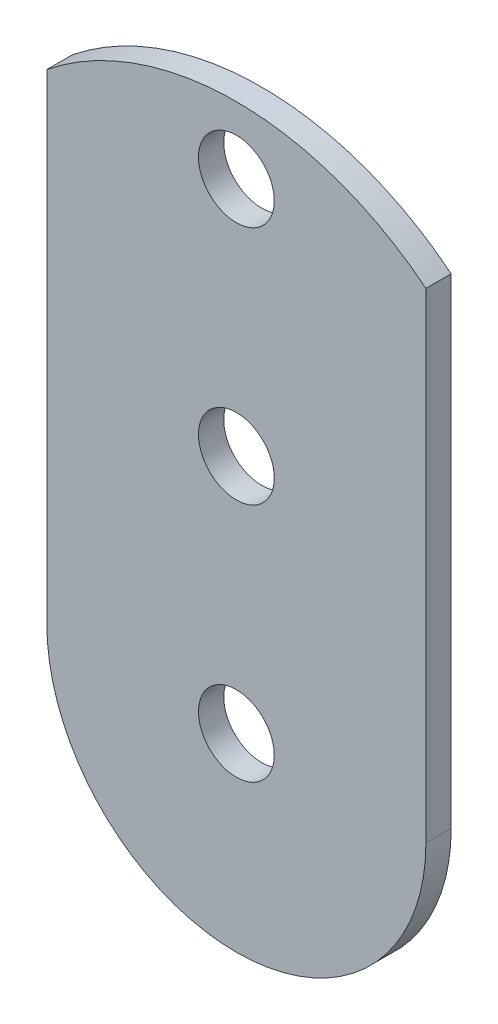
ISO-10303-21;
HEADER;
FILE_DESCRIPTION(('STEP AP214'),'2;1');
FILE_NAME('part.step','',(''),(''),'','','');
FILE_SCHEMA(('AUTOMOTIVE_DESIGN { 1 0 10303 214 1 1 1 1 }'));
ENDSEC;
DATA;
#1=APPLICATION_CONTEXT('core data for automotive mechanical design processes');
#2=APPLICATION_PROTOCOL_DEFINITION('international standard','automotive_design',2000,#1);
#3=PRODUCT_CONTEXT('',#1,'mechanical');
#4=PRODUCT('Part','Part','',(#3));
#5=PRODUCT_RELATED_PRODUCT_CATEGORY('part','',(#4));
#6=PRODUCT_DEFINITION_FORMATION('','',#4);
#7=PRODUCT_DEFINITION_CONTEXT('part definition',#1,'design');
#8=PRODUCT_DEFINITION('design','',#6,#7);
#9=PRODUCT_DEFINITION_SHAPE('','',#8);
#10=(LENGTH_UNIT() NAMED_UNIT(*) SI_UNIT(.MILLI.,.METRE.));
#11=(NAMED_UNIT(*) PLANE_ANGLE_UNIT() SI_UNIT($,.RADIAN.));
#12=(NAMED_UNIT(*) SI_UNIT($,.STERADIAN.) SOLID_ANGLE_UNIT());
#13=UNCERTAINTY_MEASURE_WITH_UNIT(LENGTH_MEASURE(1.E-05),#10,'distance_accuracy_value','');
#14=(GEOMETRIC_REPRESENTATION_CONTEXT(3) GLOBAL_UNCERTAINTY_ASSIGNED_CONTEXT((#13)) GLOBAL_UNIT_ASSIGNED_CONTEXT((#10,
#11,#12)) REPRESENTATION_CONTEXT('',''));
#15=CARTESIAN_POINT('',(0.,0.,0.));
#16=DIRECTION('',(0.,0.,1.));
#17=DIRECTION('',(1.,0.,0.));
#18=AXIS2_PLACEMENT_3D('',#15,#16,#17);
#19=CARTESIAN_POINT('',(-0.25804411415929,-41.0551102853981,2.));
#20=DIRECTION('',(0.,0.,1.));
#21=DIRECTION('',(1.,0.,0.));
#22=AXIS2_PLACEMENT_3D('',#19,#20,#21);
#23=PLANE('',#22);
#24=CARTESIAN_POINT('',(-0.25804411415929,-41.0551102853981,2.));
#25=DIRECTION('',(0.,0.,1.));
#26=DIRECTION('',(1.,0.,0.));
#27=AXIS2_PLACEMENT_3D('',#24,#25,#26);
#28=CIRCLE('',#27,2.99999999999991);
#29=CARTESIAN_POINT('',(2.74195588584062,-41.0551102853981,2.));
#30=VERTEX_POINT('',#29);
#31=EDGE_CURVE('E114',#30,#30,#28,.T.);
#32=ORIENTED_EDGE('',*,*,#31,.F.);
#33=EDGE_LOOP('',(#32));
#34=FACE_BOUND('',#33,.T.);
#35=CARTESIAN_POINT('',(-0.25804411415929,-41.0551102853981,2.));
#36=DIRECTION('',(0.,0.,1.));
#37=DIRECTION('',(1.,0.,0.));
#38=AXIS2_PLACEMENT_3D('',#35,#36,#37);
#39=CIRCLE('',#38,15.);
#40=CARTESIAN_POINT('',(-15.2580441141592,-41.0551102853981,2.));
#41=VERTEX_POINT('',#40);
#42=CARTESIAN_POINT('',(14.7419558858408,-41.0551102853981,2.));
#43=VERTEX_POINT('',#42);
#44=EDGE_CURVE('E84',#41,#43,#39,.T.);
#45=ORIENTED_EDGE('',*,*,#44,.T.);
#46=DIRECTION('',(0.,1.,0.));
#47=VECTOR('',#46,1.);
#48=CARTESIAN_POINT('',(14.7419558858408,-3.0551102853981,2.));
#49=LINE('',#48,#47);
#50=CARTESIAN_POINT('',(14.7419558858408,-3.0551102853981,2.));
#51=VERTEX_POINT('',#50);
#52=EDGE_CURVE('E79',#43,#51,#49,.T.);
#53=ORIENTED_EDGE('',*,*,#52,.T.);
#54=CARTESIAN_POINT('',(-0.258044114159474,-21.6236402003081,2.));
#55=DIRECTION('',(0.,0.,1.));
#56=DIRECTION('',(1.,0.,0.));
#57=AXIS2_PLACEMENT_3D('',#54,#55,#56);
#58=CIRCLE('',#57,23.8702807524528);
#59=CARTESIAN_POINT('',(-15.2580441141598,-3.0551102853981,2.));
#60=VERTEX_POINT('',#59);
#61=EDGE_CURVE('E82',#51,#60,#58,.T.);
#62=ORIENTED_EDGE('',*,*,#61,.T.);
#63=DIRECTION('',(0.,-1.,0.));
#64=VECTOR('',#63,1.);
#65=CARTESIAN_POINT('',(-15.2580441141598,-3.0551102853981,2.));
#66=LINE('',#65,#64);
#67=EDGE_CURVE('E49',#60,#41,#66,.T.);
#68=ORIENTED_EDGE('',*,*,#67,.T.);
#69=EDGE_LOOP('',(#45,#53,#62,#68));
#70=FACE_BOUND('',#69,.T.);
#71=CARTESIAN_POINT('',(-0.258044114159334,-22.0551102853981,2.));
#72=DIRECTION('',(0.,0.,1.));
#73=DIRECTION('',(1.,0.,0.));
#74=AXIS2_PLACEMENT_3D('',#71,#72,#73);
#75=CIRCLE('',#74,2.99999999999999);
#76=CARTESIAN_POINT('',(2.74195588584066,-22.0551102853981,2.));
#77=VERTEX_POINT('',#76);
#78=EDGE_CURVE('E99',#77,#77,#75,.T.);
#79=ORIENTED_EDGE('',*,*,#78,.F.);
#80=EDGE_LOOP('',(#79));
#81=FACE_BOUND('',#80,.T.);
#82=CARTESIAN_POINT('',(-0.258044114159474,-3.0551102853981,2.));
#83=DIRECTION('',(0.,0.,1.));
#84=DIRECTION('',(1.,0.,0.));
#85=AXIS2_PLACEMENT_3D('',#82,#83,#84);
#86=CIRCLE('',#85,2.99999999999998);
#87=CARTESIAN_POINT('',(2.7419558858405,-3.0551102853981,2.));
#88=VERTEX_POINT('',#87);
#89=EDGE_CURVE('E120',#88,#88,#86,.T.);
#90=ORIENTED_EDGE('',*,*,#89,.F.);
#91=EDGE_LOOP('',(#90));
#92=FACE_BOUND('',#91,.T.);
#93=ADVANCED_FACE('F32',(#34,#70,#81,#92),#23,.T.);
#94=CARTESIAN_POINT('',(-0.25804411415929,-41.0551102853981,0.));
#95=DIRECTION('',(0.,0.,1.));
#96=DIRECTION('',(1.,0.,0.));
#97=AXIS2_PLACEMENT_3D('',#94,#95,#96);
#98=PLANE('',#97);
#99=CARTESIAN_POINT('',(-0.25804411415929,-41.0551102853981,0.));
#100=DIRECTION('',(0.,0.,1.));
#101=DIRECTION('',(1.,0.,0.));
#102=AXIS2_PLACEMENT_3D('',#99,#100,#101);
#103=CIRCLE('',#102,15.);
#104=CARTESIAN_POINT('',(-15.2580441141592,-41.0551102853981,0.));
#105=VERTEX_POINT('',#104);
#106=CARTESIAN_POINT('',(14.7419558858408,-41.0551102853981,0.));
#107=VERTEX_POINT('',#106);
#108=EDGE_CURVE('E96',#105,#107,#103,.T.);
#109=ORIENTED_EDGE('',*,*,#108,.F.);
#110=DIRECTION('',(0.,-1.,0.));
#111=VECTOR('',#110,1.);
#112=CARTESIAN_POINT('',(-15.2580441141598,-3.0551102853981,0.));
#113=LINE('',#112,#111);
#114=CARTESIAN_POINT('',(-15.2580441141598,-3.0551102853981,0.));
#115=VERTEX_POINT('',#114);
#116=EDGE_CURVE('E72',#115,#105,#113,.T.);
#117=ORIENTED_EDGE('',*,*,#116,.F.);
#118=CARTESIAN_POINT('',(-0.258044114159474,-21.6236402003081,0.));
#119=DIRECTION('',(0.,0.,1.));
#120=DIRECTION('',(1.,0.,0.));
#121=AXIS2_PLACEMENT_3D('',#118,#119,#120);
#122=CIRCLE('',#121,23.8702807524528);
#123=CARTESIAN_POINT('',(14.7419558858408,-3.0551102853981,0.));
#124=VERTEX_POINT('',#123);
#125=EDGE_CURVE('E66',#124,#115,#122,.T.);
#126=ORIENTED_EDGE('',*,*,#125,.F.);
#127=DIRECTION('',(0.,1.,0.));
#128=VECTOR('',#127,1.);
#129=CARTESIAN_POINT('',(14.7419558858408,-3.0551102853981,0.));
#130=LINE('',#129,#128);
#131=EDGE_CURVE('E88',#107,#124,#130,.T.);
#132=ORIENTED_EDGE('',*,*,#131,.F.);
#133=EDGE_LOOP('',(#109,#117,#126,#132));
#134=FACE_BOUND('',#133,.T.);
#135=CARTESIAN_POINT('',(-0.258044114159334,-22.0551102853981,0.));
#136=DIRECTION('',(0.,0.,1.));
#137=DIRECTION('',(1.,0.,0.));
#138=AXIS2_PLACEMENT_3D('',#135,#136,#137);
#139=CIRCLE('',#138,2.99999999999999);
#140=CARTESIAN_POINT('',(2.74195588584066,-22.0551102853981,0.));
#141=VERTEX_POINT('',#140);
#142=EDGE_CURVE('E111',#141,#141,#139,.T.);
#143=ORIENTED_EDGE('',*,*,#142,.T.);
#144=EDGE_LOOP('',(#143));
#145=FACE_BOUND('',#144,.T.);
#146=CARTESIAN_POINT('',(-0.25804411415929,-41.0551102853981,0.));
#147=DIRECTION('',(0.,0.,1.));
#148=DIRECTION('',(1.,0.,0.));
#149=AXIS2_PLACEMENT_3D('',#146,#147,#148);
#150=CIRCLE('',#149,2.99999999999991);
#151=CARTESIAN_POINT('',(2.74195588584062,-41.0551102853981,0.));
#152=VERTEX_POINT('',#151);
#153=EDGE_CURVE('E117',#152,#152,#150,.T.);
#154=ORIENTED_EDGE('',*,*,#153,.T.);
#155=EDGE_LOOP('',(#154));
#156=FACE_BOUND('',#155,.T.);
#157=CARTESIAN_POINT('',(-0.258044114159474,-3.0551102853981,0.));
#158=DIRECTION('',(0.,0.,1.));
#159=DIRECTION('',(1.,0.,0.));
#160=AXIS2_PLACEMENT_3D('',#157,#158,#159);
#161=CIRCLE('',#160,2.99999999999998);
#162=CARTESIAN_POINT('',(2.7419558858405,-3.0551102853981,0.));
#163=VERTEX_POINT('',#162);
#164=EDGE_CURVE('E123',#163,#163,#161,.T.);
#165=ORIENTED_EDGE('',*,*,#164,.T.);
#166=EDGE_LOOP('',(#165));
#167=FACE_BOUND('',#166,.T.);
#168=ADVANCED_FACE('F107',(#134,#145,#156,#167),#98,.F.);
#169=CARTESIAN_POINT('',(-0.25804411415929,-41.0551102853981,2.));
#170=DIRECTION('',(0.,0.,-1.));
#171=DIRECTION('',(-1.,0.,0.));
#172=AXIS2_PLACEMENT_3D('',#169,#170,#171);
#173=CYLINDRICAL_SURFACE('',#172,15.);
#174=ORIENTED_EDGE('',*,*,#108,.T.);
#175=DIRECTION('',(0.,0.,-1.));
#176=VECTOR('',#175,1.);
#177=CARTESIAN_POINT('',(14.7419558858408,-41.0551102853981,2.));
#178=LINE('',#177,#176);
#179=EDGE_CURVE('E11',#43,#107,#178,.T.);
#180=ORIENTED_EDGE('',*,*,#179,.F.);
#181=ORIENTED_EDGE('',*,*,#44,.F.);
#182=DIRECTION('',(0.,0.,-1.));
#183=VECTOR('',#182,1.);
#184=CARTESIAN_POINT('',(-15.2580441141592,-41.0551102853981,2.));
#185=LINE('',#184,#183);
#186=EDGE_CURVE('E92',#41,#105,#185,.T.);
#187=ORIENTED_EDGE('',*,*,#186,.T.);
#188=EDGE_LOOP('',(#174,#180,#181,#187));
#189=FACE_BOUND('',#188,.T.);
#190=ADVANCED_FACE('F34',(#189),#173,.T.);
#191=CARTESIAN_POINT('',(14.7419558858408,-3.0551102853981,2.));
#192=DIRECTION('',(-1.,0.,0.));
#193=DIRECTION('',(0.,0.,1.));
#194=AXIS2_PLACEMENT_3D('',#191,#192,#193);
#195=PLANE('',#194);
#196=ORIENTED_EDGE('',*,*,#131,.T.);
#197=DIRECTION('',(0.,0.,-1.));
#198=VECTOR('',#197,1.);
#199=CARTESIAN_POINT('',(14.7419558858408,-3.0551102853981,2.));
#200=LINE('',#199,#198);
#201=EDGE_CURVE('E41',#51,#124,#200,.T.);
#202=ORIENTED_EDGE('',*,*,#201,.F.);
#203=ORIENTED_EDGE('',*,*,#52,.F.);
#204=ORIENTED_EDGE('',*,*,#179,.T.);
#205=EDGE_LOOP('',(#196,#202,#203,#204));
#206=FACE_BOUND('',#205,.T.);
#207=ADVANCED_FACE('F87',(#206),#195,.F.);
#208=CARTESIAN_POINT('',(-0.258044114159474,-21.6236402003081,2.));
#209=DIRECTION('',(0.,0.,-1.));
#210=DIRECTION('',(-1.,0.,0.));
#211=AXIS2_PLACEMENT_3D('',#208,#209,#210);
#212=CYLINDRICAL_SURFACE('',#211,23.8702807524528);
#213=ORIENTED_EDGE('',*,*,#125,.T.);
#214=DIRECTION('',(0.,0.,-1.));
#215=VECTOR('',#214,1.);
#216=CARTESIAN_POINT('',(-15.2580441141598,-3.0551102853981,2.));
#217=LINE('',#216,#215);
#218=EDGE_CURVE('E89',#60,#115,#217,.T.);
#219=ORIENTED_EDGE('',*,*,#218,.F.);
#220=ORIENTED_EDGE('',*,*,#61,.F.);
#221=ORIENTED_EDGE('',*,*,#201,.T.);
#222=EDGE_LOOP('',(#213,#219,#220,#221));
#223=FACE_BOUND('',#222,.T.);
#224=ADVANCED_FACE('F90',(#223),#212,.T.);
#225=CARTESIAN_POINT('',(-15.2580441141598,-3.0551102853981,2.));
#226=DIRECTION('',(1.,0.,0.));
#227=DIRECTION('',(0.,1.,0.));
#228=AXIS2_PLACEMENT_3D('',#225,#226,#227);
#229=PLANE('',#228);
#230=ORIENTED_EDGE('',*,*,#116,.T.);
#231=ORIENTED_EDGE('',*,*,#186,.F.);
#232=ORIENTED_EDGE('',*,*,#67,.F.);
#233=ORIENTED_EDGE('',*,*,#218,.T.);
#234=EDGE_LOOP('',(#230,#231,#232,#233));
#235=FACE_BOUND('',#234,.T.);
#236=ADVANCED_FACE('F104',(#235),#229,.F.);
#237=CARTESIAN_POINT('',(-0.258044114159334,-22.0551102853981,2.));
#238=DIRECTION('',(0.,0.,-1.));
#239=DIRECTION('',(-1.,0.,0.));
#240=AXIS2_PLACEMENT_3D('',#237,#238,#239);
#241=CYLINDRICAL_SURFACE('',#240,2.99999999999999);
#242=ORIENTED_EDGE('',*,*,#78,.T.);
#243=EDGE_LOOP('',(#242));
#244=FACE_BOUND('',#243,.T.);
#245=ORIENTED_EDGE('',*,*,#142,.F.);
#246=EDGE_LOOP('',(#245));
#247=FACE_BOUND('',#246,.T.);
#248=ADVANCED_FACE('F141',(#244,#247),#241,.F.);
#249=CARTESIAN_POINT('',(-0.25804411415929,-41.0551102853981,2.));
#250=DIRECTION('',(0.,0.,-1.));
#251=DIRECTION('',(-1.,0.,0.));
#252=AXIS2_PLACEMENT_3D('',#249,#250,#251);
#253=CYLINDRICAL_SURFACE('',#252,2.99999999999991);
#254=ORIENTED_EDGE('',*,*,#31,.T.);
#255=EDGE_LOOP('',(#254));
#256=FACE_BOUND('',#255,.T.);
#257=ORIENTED_EDGE('',*,*,#153,.F.);
#258=EDGE_LOOP('',(#257));
#259=FACE_BOUND('',#258,.T.);
#260=ADVANCED_FACE('F187',(#256,#259),#253,.F.);
#261=CARTESIAN_POINT('',(-0.258044114159474,-3.0551102853981,2.));
#262=DIRECTION('',(0.,0.,-1.));
#263=DIRECTION('',(-1.,0.,0.));
#264=AXIS2_PLACEMENT_3D('',#261,#262,#263);
#265=CYLINDRICAL_SURFACE('',#264,2.99999999999998);
#266=ORIENTED_EDGE('',*,*,#89,.T.);
#267=EDGE_LOOP('',(#266));
#268=FACE_BOUND('',#267,.T.);
#269=ORIENTED_EDGE('',*,*,#164,.F.);
#270=EDGE_LOOP('',(#269));
#271=FACE_BOUND('',#270,.T.);
#272=ADVANCED_FACE('F129',(#268,#271),#265,.F.);
#273=CLOSED_SHELL('',(#93,#168,#190,#207,#224,#236,#248,#260,#272));
#274=MANIFOLD_SOLID_BREP('B2',#273);
#275=ADVANCED_BREP_SHAPE_REPRESENTATION('',(#18,#274),#14);
#276=SHAPE_DEFINITION_REPRESENTATION(#9,#275);
ENDSEC;
END-ISO-10303-21;
